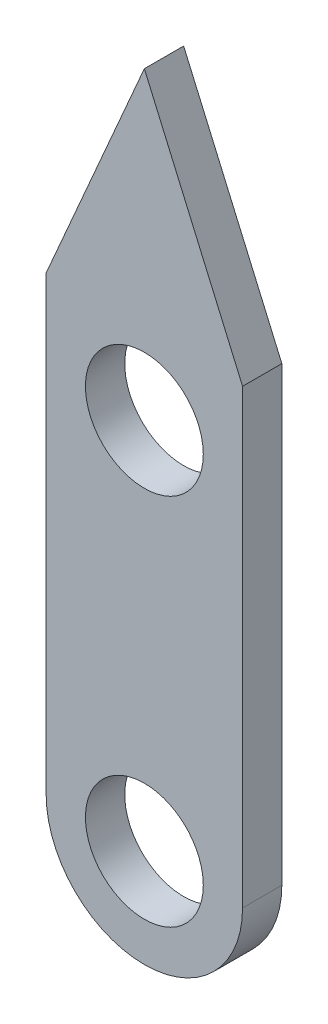
ISO-10303-21;
HEADER;
FILE_DESCRIPTION(('STEP AP214'),'2;1');
FILE_NAME('part.step','',(''),(''),'','','');
FILE_SCHEMA(('AUTOMOTIVE_DESIGN { 1 0 10303 214 1 1 1 1 }'));
ENDSEC;
DATA;
#1=APPLICATION_CONTEXT('core data for automotive mechanical design processes');
#2=APPLICATION_PROTOCOL_DEFINITION('international standard','automotive_design',2000,#1);
#3=PRODUCT_CONTEXT('',#1,'mechanical');
#4=PRODUCT('Part','Part','',(#3));
#5=PRODUCT_RELATED_PRODUCT_CATEGORY('part','',(#4));
#6=PRODUCT_DEFINITION_FORMATION('','',#4);
#7=PRODUCT_DEFINITION_CONTEXT('part definition',#1,'design');
#8=PRODUCT_DEFINITION('design','',#6,#7);
#9=PRODUCT_DEFINITION_SHAPE('','',#8);
#10=(LENGTH_UNIT() NAMED_UNIT(*) SI_UNIT(.MILLI.,.METRE.));
#11=(NAMED_UNIT(*) PLANE_ANGLE_UNIT() SI_UNIT($,.RADIAN.));
#12=(NAMED_UNIT(*) SI_UNIT($,.STERADIAN.) SOLID_ANGLE_UNIT());
#13=UNCERTAINTY_MEASURE_WITH_UNIT(LENGTH_MEASURE(1.E-05),#10,'distance_accuracy_value','');
#14=(GEOMETRIC_REPRESENTATION_CONTEXT(3) GLOBAL_UNCERTAINTY_ASSIGNED_CONTEXT((#13)) GLOBAL_UNIT_ASSIGNED_CONTEXT((#10,
#11,#12)) REPRESENTATION_CONTEXT('',''));
#15=CARTESIAN_POINT('',(0.,0.,0.));
#16=DIRECTION('',(0.,0.,1.));
#17=DIRECTION('',(1.,0.,0.));
#18=AXIS2_PLACEMENT_3D('',#15,#16,#17);
#19=CARTESIAN_POINT('',(-0.0557778867715357,-9.55341441517563,2.));
#20=DIRECTION('',(0.,0.,-1.));
#21=DIRECTION('',(-1.,0.,0.));
#22=AXIS2_PLACEMENT_3D('',#19,#20,#21);
#23=PLANE('',#22);
#24=DIRECTION('',(0.,1.,0.));
#25=VECTOR('',#24,1.);
#26=CARTESIAN_POINT('',(4.94422211322846,9.44658558482437,2.));
#27=LINE('',#26,#25);
#28=CARTESIAN_POINT('',(4.94422211322846,-9.55341441517563,2.));
#29=VERTEX_POINT('',#28);
#30=CARTESIAN_POINT('',(4.94422211322846,13.4465855848244,2.));
#31=VERTEX_POINT('',#30);
#32=EDGE_CURVE('E50',#29,#31,#27,.T.);
#33=ORIENTED_EDGE('',*,*,#32,.T.);
#34=DIRECTION('',(-0.398607867009125,0.917121457800675,0.));
#35=VECTOR('',#34,1.);
#36=CARTESIAN_POINT('',(4.94422211322846,13.4465855848244,2.));
#37=LINE('',#36,#35);
#38=CARTESIAN_POINT('',(-0.0557778867715381,24.9506417476156,2.));
#39=VERTEX_POINT('',#38);
#40=EDGE_CURVE('E84',#31,#39,#37,.T.);
#41=ORIENTED_EDGE('',*,*,#40,.T.);
#42=DIRECTION('',(-0.398607867009125,-0.917121457800675,0.));
#43=VECTOR('',#42,1.);
#44=CARTESIAN_POINT('',(-0.0557778867715381,24.9506417476156,2.));
#45=LINE('',#44,#43);
#46=CARTESIAN_POINT('',(-5.05577788677154,13.4465855848244,2.));
#47=VERTEX_POINT('',#46);
#48=EDGE_CURVE('E89',#39,#47,#45,.T.);
#49=ORIENTED_EDGE('',*,*,#48,.T.);
#50=DIRECTION('',(0.,-1.,0.));
#51=VECTOR('',#50,1.);
#52=CARTESIAN_POINT('',(-5.05577788677154,9.44658558482437,2.));
#53=LINE('',#52,#51);
#54=CARTESIAN_POINT('',(-5.05577788677154,-9.55341441517563,2.));
#55=VERTEX_POINT('',#54);
#56=EDGE_CURVE('E93',#47,#55,#53,.T.);
#57=ORIENTED_EDGE('',*,*,#56,.T.);
#58=CARTESIAN_POINT('',(-0.0557778867715357,-9.55341441517563,2.));
#59=DIRECTION('',(0.,0.,1.));
#60=DIRECTION('',(-1.,0.,0.));
#61=AXIS2_PLACEMENT_3D('',#58,#59,#60);
#62=CIRCLE('',#61,5.);
#63=EDGE_CURVE('E106',#55,#29,#62,.T.);
#64=ORIENTED_EDGE('',*,*,#63,.T.);
#65=EDGE_LOOP('',(#33,#41,#49,#57,#64));
#66=FACE_BOUND('',#65,.T.);
#67=CARTESIAN_POINT('',(-0.0557778867715381,9.44658558482437,2.));
#68=DIRECTION('',(0.,0.,1.));
#69=DIRECTION('',(1.,0.,0.));
#70=AXIS2_PLACEMENT_3D('',#67,#68,#69);
#71=CIRCLE('',#70,3.);
#72=CARTESIAN_POINT('',(2.94422211322846,9.44658558482437,2.));
#73=VERTEX_POINT('',#72);
#74=EDGE_CURVE('E114',#73,#73,#71,.T.);
#75=ORIENTED_EDGE('',*,*,#74,.F.);
#76=EDGE_LOOP('',(#75));
#77=FACE_BOUND('',#76,.T.);
#78=CARTESIAN_POINT('',(-0.0557778867715357,-9.55341441517563,2.));
#79=DIRECTION('',(0.,0.,1.));
#80=DIRECTION('',(1.,0.,0.));
#81=AXIS2_PLACEMENT_3D('',#78,#79,#80);
#82=CIRCLE('',#81,3.);
#83=CARTESIAN_POINT('',(2.94422211322846,-9.55341441517563,2.));
#84=VERTEX_POINT('',#83);
#85=EDGE_CURVE('E133',#84,#84,#82,.T.);
#86=ORIENTED_EDGE('',*,*,#85,.F.);
#87=EDGE_LOOP('',(#86));
#88=FACE_BOUND('',#87,.T.);
#89=ADVANCED_FACE('F33',(#66,#77,#88),#23,.F.);
#90=CARTESIAN_POINT('',(-0.0557778867715357,-9.55341441517563,0.));
#91=DIRECTION('',(0.,0.,-1.));
#92=DIRECTION('',(-1.,0.,0.));
#93=AXIS2_PLACEMENT_3D('',#90,#91,#92);
#94=PLANE('',#93);
#95=CARTESIAN_POINT('',(-0.0557778867715381,9.44658558482437,0.));
#96=DIRECTION('',(0.,0.,1.));
#97=DIRECTION('',(1.,0.,0.));
#98=AXIS2_PLACEMENT_3D('',#95,#96,#97);
#99=CIRCLE('',#98,3.);
#100=CARTESIAN_POINT('',(2.94422211322846,9.44658558482437,0.));
#101=VERTEX_POINT('',#100);
#102=EDGE_CURVE('E130',#101,#101,#99,.T.);
#103=ORIENTED_EDGE('',*,*,#102,.T.);
#104=EDGE_LOOP('',(#103));
#105=FACE_BOUND('',#104,.T.);
#106=DIRECTION('',(-0.398607867009125,0.917121457800675,0.));
#107=VECTOR('',#106,1.);
#108=CARTESIAN_POINT('',(4.94422211322846,13.4465855848244,0.));
#109=LINE('',#108,#107);
#110=CARTESIAN_POINT('',(4.94422211322846,13.4465855848244,0.));
#111=VERTEX_POINT('',#110);
#112=CARTESIAN_POINT('',(-0.0557778867715381,24.9506417476156,0.));
#113=VERTEX_POINT('',#112);
#114=EDGE_CURVE('E112',#111,#113,#109,.T.);
#115=ORIENTED_EDGE('',*,*,#114,.F.);
#116=DIRECTION('',(0.,1.,0.));
#117=VECTOR('',#116,1.);
#118=CARTESIAN_POINT('',(4.94422211322846,9.44658558482437,0.));
#119=LINE('',#118,#117);
#120=CARTESIAN_POINT('',(4.94422211322846,-9.55341441517563,0.));
#121=VERTEX_POINT('',#120);
#122=EDGE_CURVE('E118',#121,#111,#119,.T.);
#123=ORIENTED_EDGE('',*,*,#122,.F.);
#124=CARTESIAN_POINT('',(-0.0557778867715357,-9.55341441517563,0.));
#125=DIRECTION('',(0.,0.,1.));
#126=DIRECTION('',(-1.,0.,0.));
#127=AXIS2_PLACEMENT_3D('',#124,#125,#126);
#128=CIRCLE('',#127,5.);
#129=CARTESIAN_POINT('',(-5.05577788677154,-9.55341441517563,0.));
#130=VERTEX_POINT('',#129);
#131=EDGE_CURVE('E77',#130,#121,#128,.T.);
#132=ORIENTED_EDGE('',*,*,#131,.F.);
#133=DIRECTION('',(0.,-1.,0.));
#134=VECTOR('',#133,1.);
#135=CARTESIAN_POINT('',(-5.05577788677154,9.44658558482437,0.));
#136=LINE('',#135,#134);
#137=CARTESIAN_POINT('',(-5.05577788677154,13.4465855848244,0.));
#138=VERTEX_POINT('',#137);
#139=EDGE_CURVE('E70',#138,#130,#136,.T.);
#140=ORIENTED_EDGE('',*,*,#139,.F.);
#141=DIRECTION('',(-0.398607867009125,-0.917121457800675,0.));
#142=VECTOR('',#141,1.);
#143=CARTESIAN_POINT('',(-0.0557778867715381,24.9506417476156,0.));
#144=LINE('',#143,#142);
#145=EDGE_CURVE('E101',#113,#138,#144,.T.);
#146=ORIENTED_EDGE('',*,*,#145,.F.);
#147=EDGE_LOOP('',(#115,#123,#132,#140,#146));
#148=FACE_BOUND('',#147,.T.);
#149=CARTESIAN_POINT('',(-0.0557778867715357,-9.55341441517563,0.));
#150=DIRECTION('',(0.,0.,1.));
#151=DIRECTION('',(1.,0.,0.));
#152=AXIS2_PLACEMENT_3D('',#149,#150,#151);
#153=CIRCLE('',#152,3.);
#154=CARTESIAN_POINT('',(2.94422211322846,-9.55341441517563,0.));
#155=VERTEX_POINT('',#154);
#156=EDGE_CURVE('E136',#155,#155,#153,.T.);
#157=ORIENTED_EDGE('',*,*,#156,.T.);
#158=EDGE_LOOP('',(#157));
#159=FACE_BOUND('',#158,.T.);
#160=ADVANCED_FACE('F123',(#105,#148,#159),#94,.T.);
#161=CARTESIAN_POINT('',(4.94422211322846,13.4465855848244,2.));
#162=DIRECTION('',(-0.917121457800675,-0.398607867009125,0.));
#163=DIRECTION('',(0.398607867009125,-0.917121457800675,0.));
#164=AXIS2_PLACEMENT_3D('',#161,#162,#163);
#165=PLANE('',#164);
#166=ORIENTED_EDGE('',*,*,#114,.T.);
#167=DIRECTION('',(0.,0.,-1.));
#168=VECTOR('',#167,1.);
#169=CARTESIAN_POINT('',(-0.0557778867715381,24.9506417476156,2.));
#170=LINE('',#169,#168);
#171=EDGE_CURVE('E42',#39,#113,#170,.T.);
#172=ORIENTED_EDGE('',*,*,#171,.F.);
#173=ORIENTED_EDGE('',*,*,#40,.F.);
#174=DIRECTION('',(0.,0.,-1.));
#175=VECTOR('',#174,1.);
#176=CARTESIAN_POINT('',(4.94422211322846,13.4465855848244,2.));
#177=LINE('',#176,#175);
#178=EDGE_CURVE('E11',#31,#111,#177,.T.);
#179=ORIENTED_EDGE('',*,*,#178,.T.);
#180=EDGE_LOOP('',(#166,#172,#173,#179));
#181=FACE_BOUND('',#180,.T.);
#182=ADVANCED_FACE('F35',(#181),#165,.F.);
#183=CARTESIAN_POINT('',(-0.0557778867715381,24.9506417476156,2.));
#184=DIRECTION('',(0.917121457800675,-0.398607867009125,0.));
#185=DIRECTION('',(0.398607867009125,0.917121457800675,0.));
#186=AXIS2_PLACEMENT_3D('',#183,#184,#185);
#187=PLANE('',#186);
#188=ORIENTED_EDGE('',*,*,#145,.T.);
#189=DIRECTION('',(0.,0.,-1.));
#190=VECTOR('',#189,1.);
#191=CARTESIAN_POINT('',(-5.05577788677154,13.4465855848244,2.));
#192=LINE('',#191,#190);
#193=EDGE_CURVE('E98',#47,#138,#192,.T.);
#194=ORIENTED_EDGE('',*,*,#193,.F.);
#195=ORIENTED_EDGE('',*,*,#48,.F.);
#196=ORIENTED_EDGE('',*,*,#171,.T.);
#197=EDGE_LOOP('',(#188,#194,#195,#196));
#198=FACE_BOUND('',#197,.T.);
#199=ADVANCED_FACE('F99',(#198),#187,.F.);
#200=CARTESIAN_POINT('',(-5.05577788677154,9.44658558482437,2.));
#201=DIRECTION('',(1.,0.,0.));
#202=DIRECTION('',(0.,0.,-1.));
#203=AXIS2_PLACEMENT_3D('',#200,#201,#202);
#204=PLANE('',#203);
#205=ORIENTED_EDGE('',*,*,#139,.T.);
#206=DIRECTION('',(0.,0.,-1.));
#207=VECTOR('',#206,1.);
#208=CARTESIAN_POINT('',(-5.05577788677154,-9.55341441517563,2.));
#209=LINE('',#208,#207);
#210=EDGE_CURVE('E102',#55,#130,#209,.T.);
#211=ORIENTED_EDGE('',*,*,#210,.F.);
#212=ORIENTED_EDGE('',*,*,#56,.F.);
#213=ORIENTED_EDGE('',*,*,#193,.T.);
#214=EDGE_LOOP('',(#205,#211,#212,#213));
#215=FACE_BOUND('',#214,.T.);
#216=ADVANCED_FACE('F104',(#215),#204,.F.);
#217=CARTESIAN_POINT('',(-0.0557778867715357,-9.55341441517563,2.));
#218=DIRECTION('',(0.,0.,-1.));
#219=DIRECTION('',(-1.,0.,0.));
#220=AXIS2_PLACEMENT_3D('',#217,#218,#219);
#221=CYLINDRICAL_SURFACE('',#220,5.);
#222=ORIENTED_EDGE('',*,*,#131,.T.);
#223=DIRECTION('',(0.,0.,-1.));
#224=VECTOR('',#223,1.);
#225=CARTESIAN_POINT('',(4.94422211322846,-9.55341441517563,2.));
#226=LINE('',#225,#224);
#227=EDGE_CURVE('E108',#29,#121,#226,.T.);
#228=ORIENTED_EDGE('',*,*,#227,.F.);
#229=ORIENTED_EDGE('',*,*,#63,.F.);
#230=ORIENTED_EDGE('',*,*,#210,.T.);
#231=EDGE_LOOP('',(#222,#228,#229,#230));
#232=FACE_BOUND('',#231,.T.);
#233=ADVANCED_FACE('F127',(#232),#221,.T.);
#234=CARTESIAN_POINT('',(4.94422211322846,9.44658558482437,2.));
#235=DIRECTION('',(-1.,0.,0.));
#236=DIRECTION('',(0.,0.,1.));
#237=AXIS2_PLACEMENT_3D('',#234,#235,#236);
#238=PLANE('',#237);
#239=ORIENTED_EDGE('',*,*,#122,.T.);
#240=ORIENTED_EDGE('',*,*,#178,.F.);
#241=ORIENTED_EDGE('',*,*,#32,.F.);
#242=ORIENTED_EDGE('',*,*,#227,.T.);
#243=EDGE_LOOP('',(#239,#240,#241,#242));
#244=FACE_BOUND('',#243,.T.);
#245=ADVANCED_FACE('F126',(#244),#238,.F.);
#246=CARTESIAN_POINT('',(-0.0557778867715381,9.44658558482437,2.));
#247=DIRECTION('',(0.,0.,-1.));
#248=DIRECTION('',(-1.,0.,0.));
#249=AXIS2_PLACEMENT_3D('',#246,#247,#248);
#250=CYLINDRICAL_SURFACE('',#249,3.);
#251=ORIENTED_EDGE('',*,*,#74,.T.);
#252=EDGE_LOOP('',(#251));
#253=FACE_BOUND('',#252,.T.);
#254=ORIENTED_EDGE('',*,*,#102,.F.);
#255=EDGE_LOOP('',(#254));
#256=FACE_BOUND('',#255,.T.);
#257=ADVANCED_FACE('F153',(#253,#256),#250,.F.);
#258=CARTESIAN_POINT('',(-0.0557778867715357,-9.55341441517563,2.));
#259=DIRECTION('',(0.,0.,-1.));
#260=DIRECTION('',(-1.,0.,0.));
#261=AXIS2_PLACEMENT_3D('',#258,#259,#260);
#262=CYLINDRICAL_SURFACE('',#261,3.);
#263=ORIENTED_EDGE('',*,*,#85,.T.);
#264=EDGE_LOOP('',(#263));
#265=FACE_BOUND('',#264,.T.);
#266=ORIENTED_EDGE('',*,*,#156,.F.);
#267=EDGE_LOOP('',(#266));
#268=FACE_BOUND('',#267,.T.);
#269=ADVANCED_FACE('F142',(#265,#268),#262,.F.);
#270=CLOSED_SHELL('',(#89,#160,#182,#199,#216,#233,#245,#257,#269));
#271=MANIFOLD_SOLID_BREP('B2',#270);
#272=ADVANCED_BREP_SHAPE_REPRESENTATION('',(#18,#271),#14);
#273=SHAPE_DEFINITION_REPRESENTATION(#9,#272);
ENDSEC;
END-ISO-10303-21;
